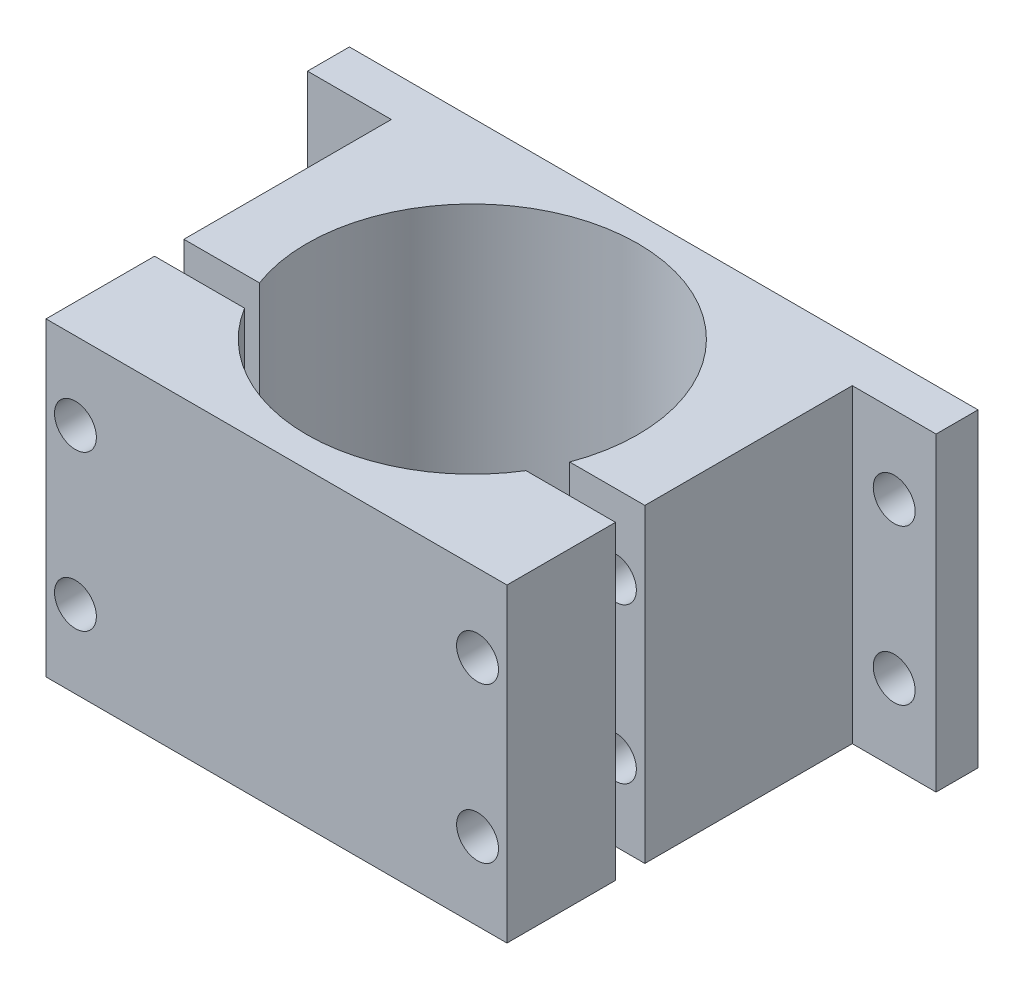
ISO-10303-21;
HEADER;
FILE_DESCRIPTION(('STEP AP214'),'2;1');
FILE_NAME('part.step','',(''),(''),'','','');
FILE_SCHEMA(('AUTOMOTIVE_DESIGN { 1 0 10303 214 1 1 1 1 }'));
ENDSEC;
DATA;
#1=APPLICATION_CONTEXT('core data for automotive mechanical design processes');
#2=APPLICATION_PROTOCOL_DEFINITION('international standard','automotive_design',2000,#1);
#3=PRODUCT_CONTEXT('',#1,'mechanical');
#4=PRODUCT('Part','Part','',(#3));
#5=PRODUCT_RELATED_PRODUCT_CATEGORY('part','',(#4));
#6=PRODUCT_DEFINITION_FORMATION('','',#4);
#7=PRODUCT_DEFINITION_CONTEXT('part definition',#1,'design');
#8=PRODUCT_DEFINITION('design','',#6,#7);
#9=PRODUCT_DEFINITION_SHAPE('','',#8);
#10=(LENGTH_UNIT() NAMED_UNIT(*) SI_UNIT(.MILLI.,.METRE.));
#11=(NAMED_UNIT(*) PLANE_ANGLE_UNIT() SI_UNIT($,.RADIAN.));
#12=(NAMED_UNIT(*) SI_UNIT($,.STERADIAN.) SOLID_ANGLE_UNIT());
#13=UNCERTAINTY_MEASURE_WITH_UNIT(LENGTH_MEASURE(1.E-05),#10,'distance_accuracy_value','');
#14=(GEOMETRIC_REPRESENTATION_CONTEXT(3) GLOBAL_UNCERTAINTY_ASSIGNED_CONTEXT((#13)) GLOBAL_UNIT_ASSIGNED_CONTEXT((#10,
#11,#12)) REPRESENTATION_CONTEXT('',''));
#15=CARTESIAN_POINT('',(0.,0.,0.));
#16=DIRECTION('',(0.,0.,1.));
#17=DIRECTION('',(1.,0.,0.));
#18=AXIS2_PLACEMENT_3D('',#15,#16,#17);
#19=CARTESIAN_POINT('',(0.,0.,5.));
#20=DIRECTION('',(0.,0.,-1.));
#21=DIRECTION('',(-1.,0.,0.));
#22=AXIS2_PLACEMENT_3D('',#19,#20,#21);
#23=PLANE('',#22);
#24=DIRECTION('',(0.,-1.,0.));
#25=VECTOR('',#24,1.);
#26=CARTESIAN_POINT('',(-27.5,18.5,5.));
#27=LINE('',#26,#25);
#28=CARTESIAN_POINT('',(-27.5,18.5,5.));
#29=VERTEX_POINT('',#28);
#30=CARTESIAN_POINT('',(-27.5,-18.5,5.));
#31=VERTEX_POINT('',#30);
#32=EDGE_CURVE('E174',#29,#31,#27,.T.);
#33=ORIENTED_EDGE('',*,*,#32,.F.);
#34=DIRECTION('',(-1.,0.,0.));
#35=VECTOR('',#34,1.);
#36=CARTESIAN_POINT('',(-37.5,18.5,5.));
#37=LINE('',#36,#35);
#38=CARTESIAN_POINT('',(-37.5,18.5,5.));
#39=VERTEX_POINT('',#38);
#40=EDGE_CURVE('E296',#29,#39,#37,.T.);
#41=ORIENTED_EDGE('',*,*,#40,.T.);
#42=DIRECTION('',(0.,-1.,0.));
#43=VECTOR('',#42,1.);
#44=CARTESIAN_POINT('',(-37.5,-18.5,5.));
#45=LINE('',#44,#43);
#46=CARTESIAN_POINT('',(-37.5,-18.5,5.));
#47=VERTEX_POINT('',#46);
#48=EDGE_CURVE('E278',#39,#47,#45,.T.);
#49=ORIENTED_EDGE('',*,*,#48,.T.);
#50=DIRECTION('',(1.,0.,0.));
#51=VECTOR('',#50,1.);
#52=CARTESIAN_POINT('',(-37.5,-18.5,5.));
#53=LINE('',#52,#51);
#54=EDGE_CURVE('E275',#47,#31,#53,.T.);
#55=ORIENTED_EDGE('',*,*,#54,.T.);
#56=EDGE_LOOP('',(#33,#41,#49,#55));
#57=FACE_BOUND('',#56,.T.);
#58=CARTESIAN_POINT('',(-32.5,-9.24999999999999,5.));
#59=DIRECTION('',(0.,0.,-1.));
#60=DIRECTION('',(-1.,0.,0.));
#61=AXIS2_PLACEMENT_3D('',#58,#59,#60);
#62=CIRCLE('',#61,2.50000000000002);
#63=CARTESIAN_POINT('',(-35.,-9.24999999999999,5.));
#64=VERTEX_POINT('',#63);
#65=EDGE_CURVE('E343',#64,#64,#62,.T.);
#66=ORIENTED_EDGE('',*,*,#65,.T.);
#67=EDGE_LOOP('',(#66));
#68=FACE_BOUND('',#67,.T.);
#69=CARTESIAN_POINT('',(-32.5,9.25000000000001,5.));
#70=DIRECTION('',(0.,0.,1.));
#71=DIRECTION('',(1.,0.,0.));
#72=AXIS2_PLACEMENT_3D('',#69,#70,#71);
#73=CIRCLE('',#72,2.50000000000002);
#74=CARTESIAN_POINT('',(-30.,9.25000000000001,5.));
#75=VERTEX_POINT('',#74);
#76=EDGE_CURVE('E351',#75,#75,#73,.T.);
#77=ORIENTED_EDGE('',*,*,#76,.F.);
#78=EDGE_LOOP('',(#77));
#79=FACE_BOUND('',#78,.T.);
#80=ADVANCED_FACE('F53',(#57,#68,#79),#23,.F.);
#81=DIRECTION('',(0.,1.,0.));
#82=VECTOR('',#81,1.);
#83=CARTESIAN_POINT('',(27.5,-18.5,5.));
#84=LINE('',#83,#82);
#85=CARTESIAN_POINT('',(27.5,-18.5,5.));
#86=VERTEX_POINT('',#85);
#87=CARTESIAN_POINT('',(27.5,18.5,5.));
#88=VERTEX_POINT('',#87);
#89=EDGE_CURVE('E178',#86,#88,#84,.T.);
#90=ORIENTED_EDGE('',*,*,#89,.F.);
#91=CARTESIAN_POINT('',(37.5,-18.5,5.));
#92=VERTEX_POINT('',#91);
#93=EDGE_CURVE('E154',#86,#92,#53,.T.);
#94=ORIENTED_EDGE('',*,*,#93,.T.);
#95=DIRECTION('',(0.,1.,0.));
#96=VECTOR('',#95,1.);
#97=CARTESIAN_POINT('',(37.5,-18.5,5.));
#98=LINE('',#97,#96);
#99=CARTESIAN_POINT('',(37.5,18.5,5.));
#100=VERTEX_POINT('',#99);
#101=EDGE_CURVE('E297',#92,#100,#98,.T.);
#102=ORIENTED_EDGE('',*,*,#101,.T.);
#103=EDGE_CURVE('E292',#100,#88,#37,.T.);
#104=ORIENTED_EDGE('',*,*,#103,.T.);
#105=EDGE_LOOP('',(#90,#94,#102,#104));
#106=FACE_BOUND('',#105,.T.);
#107=CARTESIAN_POINT('',(32.5,9.25,5.));
#108=DIRECTION('',(0.,0.,-1.));
#109=DIRECTION('',(-1.,0.,0.));
#110=AXIS2_PLACEMENT_3D('',#107,#108,#109);
#111=CIRCLE('',#110,2.5);
#112=CARTESIAN_POINT('',(30.,9.25,5.));
#113=VERTEX_POINT('',#112);
#114=EDGE_CURVE('E338',#113,#113,#111,.T.);
#115=ORIENTED_EDGE('',*,*,#114,.T.);
#116=EDGE_LOOP('',(#115));
#117=FACE_BOUND('',#116,.T.);
#118=CARTESIAN_POINT('',(32.5,-9.25,5.));
#119=DIRECTION('',(0.,0.,1.));
#120=DIRECTION('',(1.,0.,0.));
#121=AXIS2_PLACEMENT_3D('',#118,#119,#120);
#122=CIRCLE('',#121,2.5);
#123=CARTESIAN_POINT('',(35.,-9.25,5.));
#124=VERTEX_POINT('',#123);
#125=EDGE_CURVE('E334',#124,#124,#122,.T.);
#126=ORIENTED_EDGE('',*,*,#125,.F.);
#127=EDGE_LOOP('',(#126));
#128=FACE_BOUND('',#127,.T.);
#129=ADVANCED_FACE('F215',(#106,#117,#128),#23,.F.);
#130=CARTESIAN_POINT('',(0.,0.,0.));
#131=DIRECTION('',(0.,0.,-1.));
#132=DIRECTION('',(-1.,0.,0.));
#133=AXIS2_PLACEMENT_3D('',#130,#131,#132);
#134=PLANE('',#133);
#135=CARTESIAN_POINT('',(-32.5,-9.24999999999999,0.));
#136=DIRECTION('',(0.,0.,-1.));
#137=DIRECTION('',(-1.,0.,0.));
#138=AXIS2_PLACEMENT_3D('',#135,#136,#137);
#139=CIRCLE('',#138,2.50000000000002);
#140=CARTESIAN_POINT('',(-35.,-9.24999999999999,0.));
#141=VERTEX_POINT('',#140);
#142=EDGE_CURVE('E347',#141,#141,#139,.T.);
#143=ORIENTED_EDGE('',*,*,#142,.F.);
#144=EDGE_LOOP('',(#143));
#145=FACE_BOUND('',#144,.T.);
#146=CARTESIAN_POINT('',(32.5,9.25,0.));
#147=DIRECTION('',(0.,0.,-1.));
#148=DIRECTION('',(-1.,0.,0.));
#149=AXIS2_PLACEMENT_3D('',#146,#147,#148);
#150=CIRCLE('',#149,2.5);
#151=CARTESIAN_POINT('',(30.,9.25,0.));
#152=VERTEX_POINT('',#151);
#153=EDGE_CURVE('E358',#152,#152,#150,.T.);
#154=ORIENTED_EDGE('',*,*,#153,.F.);
#155=EDGE_LOOP('',(#154));
#156=FACE_BOUND('',#155,.T.);
#157=DIRECTION('',(0.,1.,0.));
#158=VECTOR('',#157,1.);
#159=CARTESIAN_POINT('',(37.5,-18.5,0.));
#160=LINE('',#159,#158);
#161=CARTESIAN_POINT('',(37.5,-18.5,0.));
#162=VERTEX_POINT('',#161);
#163=CARTESIAN_POINT('',(37.5,18.5,0.));
#164=VERTEX_POINT('',#163);
#165=EDGE_CURVE('E156',#162,#164,#160,.T.);
#166=ORIENTED_EDGE('',*,*,#165,.F.);
#167=DIRECTION('',(1.,0.,0.));
#168=VECTOR('',#167,1.);
#169=CARTESIAN_POINT('',(-37.5,-18.5,0.));
#170=LINE('',#169,#168);
#171=CARTESIAN_POINT('',(-37.5,-18.5,0.));
#172=VERTEX_POINT('',#171);
#173=EDGE_CURVE('E300',#172,#162,#170,.T.);
#174=ORIENTED_EDGE('',*,*,#173,.F.);
#175=DIRECTION('',(0.,-1.,0.));
#176=VECTOR('',#175,1.);
#177=CARTESIAN_POINT('',(-37.5,-18.5,0.));
#178=LINE('',#177,#176);
#179=CARTESIAN_POINT('',(-37.5,18.5,0.));
#180=VERTEX_POINT('',#179);
#181=EDGE_CURVE('E375',#180,#172,#178,.T.);
#182=ORIENTED_EDGE('',*,*,#181,.F.);
#183=DIRECTION('',(-1.,0.,0.));
#184=VECTOR('',#183,1.);
#185=CARTESIAN_POINT('',(-37.5,18.5,0.));
#186=LINE('',#185,#184);
#187=EDGE_CURVE('E163',#164,#180,#186,.T.);
#188=ORIENTED_EDGE('',*,*,#187,.F.);
#189=EDGE_LOOP('',(#166,#174,#182,#188));
#190=FACE_BOUND('',#189,.T.);
#191=CARTESIAN_POINT('',(32.5,-9.25,0.));
#192=DIRECTION('',(0.,0.,1.));
#193=DIRECTION('',(1.,0.,0.));
#194=AXIS2_PLACEMENT_3D('',#191,#192,#193);
#195=CIRCLE('',#194,2.5);
#196=CARTESIAN_POINT('',(35.,-9.25,0.));
#197=VERTEX_POINT('',#196);
#198=EDGE_CURVE('E339',#197,#197,#195,.T.);
#199=ORIENTED_EDGE('',*,*,#198,.T.);
#200=EDGE_LOOP('',(#199));
#201=FACE_BOUND('',#200,.T.);
#202=CARTESIAN_POINT('',(-32.5,9.25000000000001,0.));
#203=DIRECTION('',(0.,0.,1.));
#204=DIRECTION('',(1.,0.,0.));
#205=AXIS2_PLACEMENT_3D('',#202,#203,#204);
#206=CIRCLE('',#205,2.50000000000002);
#207=CARTESIAN_POINT('',(-30.,9.25000000000001,0.));
#208=VERTEX_POINT('',#207);
#209=EDGE_CURVE('E333',#208,#208,#206,.T.);
#210=ORIENTED_EDGE('',*,*,#209,.T.);
#211=EDGE_LOOP('',(#210));
#212=FACE_BOUND('',#211,.T.);
#213=ADVANCED_FACE('F221',(#145,#156,#190,#201,#212),#134,.T.);
#214=CARTESIAN_POINT('',(-37.5,18.5,5.));
#215=DIRECTION('',(0.,-1.,0.));
#216=DIRECTION('',(0.,0.,-1.));
#217=AXIS2_PLACEMENT_3D('',#214,#215,#216);
#218=PLANE('',#217);
#219=DIRECTION('',(0.,0.,-1.));
#220=VECTOR('',#219,1.);
#221=CARTESIAN_POINT('',(-27.5,18.5,46.2));
#222=LINE('',#221,#220);
#223=CARTESIAN_POINT('',(-27.5,18.5,29.7481346849605));
#224=VERTEX_POINT('',#223);
#225=EDGE_CURVE('E160',#224,#29,#222,.T.);
#226=ORIENTED_EDGE('',*,*,#225,.F.);
#227=DIRECTION('',(-1.,0.,0.));
#228=VECTOR('',#227,1.);
#229=CARTESIAN_POINT('',(-27.5,18.5,29.7481346849605));
#230=LINE('',#229,#228);
#231=CARTESIAN_POINT('',(-18.4844653821485,18.5,29.7481346849605));
#232=VERTEX_POINT('',#231);
#233=EDGE_CURVE('E310',#232,#224,#230,.T.);
#234=ORIENTED_EDGE('',*,*,#233,.F.);
#235=CARTESIAN_POINT('',(0.02356834465743,18.5,22.8550085750294));
#236=DIRECTION('',(0.,1.,0.));
#237=DIRECTION('',(0.,0.,1.));
#238=AXIS2_PLACEMENT_3D('',#235,#236,#237);
#239=CIRCLE('',#238,19.75);
#240=CARTESIAN_POINT('',(18.5316020714634,18.5,29.7481346849605));
#241=VERTEX_POINT('',#240);
#242=EDGE_CURVE('E177',#241,#232,#239,.T.);
#243=ORIENTED_EDGE('',*,*,#242,.F.);
#244=CARTESIAN_POINT('',(27.5,18.5,29.7481346849605));
#245=VERTEX_POINT('',#244);
#246=EDGE_CURVE('E79',#245,#241,#230,.T.);
#247=ORIENTED_EDGE('',*,*,#246,.F.);
#248=DIRECTION('',(0.,0.,-1.));
#249=VECTOR('',#248,1.);
#250=CARTESIAN_POINT('',(27.5,18.5,46.2));
#251=LINE('',#250,#249);
#252=EDGE_CURVE('E147',#245,#88,#251,.T.);
#253=ORIENTED_EDGE('',*,*,#252,.T.);
#254=ORIENTED_EDGE('',*,*,#103,.F.);
#255=DIRECTION('',(0.,0.,-1.));
#256=VECTOR('',#255,1.);
#257=CARTESIAN_POINT('',(37.5,18.5,5.));
#258=LINE('',#257,#256);
#259=EDGE_CURVE('E307',#100,#164,#258,.T.);
#260=ORIENTED_EDGE('',*,*,#259,.T.);
#261=ORIENTED_EDGE('',*,*,#187,.T.);
#262=DIRECTION('',(0.,0.,-1.));
#263=VECTOR('',#262,1.);
#264=CARTESIAN_POINT('',(-37.5,18.5,5.));
#265=LINE('',#264,#263);
#266=EDGE_CURVE('E367',#39,#180,#265,.T.);
#267=ORIENTED_EDGE('',*,*,#266,.F.);
#268=ORIENTED_EDGE('',*,*,#40,.F.);
#269=EDGE_LOOP('',(#226,#234,#243,#247,#253,#254,#260,#261,#267,#268));
#270=FACE_BOUND('',#269,.T.);
#271=ADVANCED_FACE('F255',(#270),#218,.F.);
#272=CARTESIAN_POINT('',(-37.5,-18.5,5.));
#273=DIRECTION('',(0.,1.,0.));
#274=DIRECTION('',(0.,0.,1.));
#275=AXIS2_PLACEMENT_3D('',#272,#273,#274);
#276=PLANE('',#275);
#277=DIRECTION('',(0.,0.,-1.));
#278=VECTOR('',#277,1.);
#279=CARTESIAN_POINT('',(27.5,-18.5,46.2));
#280=LINE('',#279,#278);
#281=CARTESIAN_POINT('',(27.5,-18.5,29.7481346849605));
#282=VERTEX_POINT('',#281);
#283=EDGE_CURVE('E145',#282,#86,#280,.T.);
#284=ORIENTED_EDGE('',*,*,#283,.F.);
#285=DIRECTION('',(-1.,0.,0.));
#286=VECTOR('',#285,1.);
#287=CARTESIAN_POINT('',(-27.5,-18.5,29.7481346849605));
#288=LINE('',#287,#286);
#289=CARTESIAN_POINT('',(18.5316020714634,-18.5,29.7481346849605));
#290=VERTEX_POINT('',#289);
#291=EDGE_CURVE('E131',#282,#290,#288,.T.);
#292=ORIENTED_EDGE('',*,*,#291,.T.);
#293=CARTESIAN_POINT('',(0.02356834465743,-18.5,22.8550085750294));
#294=DIRECTION('',(0.,1.,0.));
#295=DIRECTION('',(0.,0.,1.));
#296=AXIS2_PLACEMENT_3D('',#293,#294,#295);
#297=CIRCLE('',#296,19.75);
#298=CARTESIAN_POINT('',(-18.4844653821485,-18.5,29.7481346849605));
#299=VERTEX_POINT('',#298);
#300=EDGE_CURVE('E175',#290,#299,#297,.T.);
#301=ORIENTED_EDGE('',*,*,#300,.T.);
#302=CARTESIAN_POINT('',(-27.5,-18.5,29.7481346849605));
#303=VERTEX_POINT('',#302);
#304=EDGE_CURVE('E71',#299,#303,#288,.T.);
#305=ORIENTED_EDGE('',*,*,#304,.T.);
#306=DIRECTION('',(0.,0.,-1.));
#307=VECTOR('',#306,1.);
#308=CARTESIAN_POINT('',(-27.5,-18.5,46.2));
#309=LINE('',#308,#307);
#310=EDGE_CURVE('E171',#303,#31,#309,.T.);
#311=ORIENTED_EDGE('',*,*,#310,.T.);
#312=ORIENTED_EDGE('',*,*,#54,.F.);
#313=DIRECTION('',(0.,0.,-1.));
#314=VECTOR('',#313,1.);
#315=CARTESIAN_POINT('',(-37.5,-18.5,5.));
#316=LINE('',#315,#314);
#317=EDGE_CURVE('E286',#47,#172,#316,.T.);
#318=ORIENTED_EDGE('',*,*,#317,.T.);
#319=ORIENTED_EDGE('',*,*,#173,.T.);
#320=DIRECTION('',(0.,0.,-1.));
#321=VECTOR('',#320,1.);
#322=CARTESIAN_POINT('',(37.5,-18.5,5.));
#323=LINE('',#322,#321);
#324=EDGE_CURVE('E281',#92,#162,#323,.T.);
#325=ORIENTED_EDGE('',*,*,#324,.F.);
#326=ORIENTED_EDGE('',*,*,#93,.F.);
#327=EDGE_LOOP('',(#284,#292,#301,#305,#311,#312,#318,#319,#325,#326));
#328=FACE_BOUND('',#327,.T.);
#329=ADVANCED_FACE('F152',(#328),#276,.F.);
#330=CARTESIAN_POINT('',(27.5,-18.5,46.2));
#331=DIRECTION('',(-1.,0.,0.));
#332=DIRECTION('',(0.,0.,1.));
#333=AXIS2_PLACEMENT_3D('',#330,#331,#332);
#334=PLANE('',#333);
#335=ORIENTED_EDGE('',*,*,#252,.F.);
#336=DIRECTION('',(0.,1.,0.));
#337=VECTOR('',#336,1.);
#338=CARTESIAN_POINT('',(27.5,-18.5,29.7481346849605));
#339=LINE('',#338,#337);
#340=EDGE_CURVE('E134',#282,#245,#339,.T.);
#341=ORIENTED_EDGE('',*,*,#340,.F.);
#342=ORIENTED_EDGE('',*,*,#283,.T.);
#343=ORIENTED_EDGE('',*,*,#89,.T.);
#344=EDGE_LOOP('',(#335,#341,#342,#343));
#345=FACE_BOUND('',#344,.T.);
#346=ADVANCED_FACE('F55',(#345),#334,.F.);
#347=CARTESIAN_POINT('',(-27.5,18.5,46.2));
#348=DIRECTION('',(1.,0.,0.));
#349=DIRECTION('',(0.,0.,-1.));
#350=AXIS2_PLACEMENT_3D('',#347,#348,#349);
#351=PLANE('',#350);
#352=ORIENTED_EDGE('',*,*,#310,.F.);
#353=DIRECTION('',(0.,1.,0.));
#354=VECTOR('',#353,1.);
#355=CARTESIAN_POINT('',(-27.5,-18.5,29.7481346849605));
#356=LINE('',#355,#354);
#357=EDGE_CURVE('E149',#303,#224,#356,.T.);
#358=ORIENTED_EDGE('',*,*,#357,.T.);
#359=ORIENTED_EDGE('',*,*,#225,.T.);
#360=ORIENTED_EDGE('',*,*,#32,.T.);
#361=EDGE_LOOP('',(#352,#358,#359,#360));
#362=FACE_BOUND('',#361,.T.);
#363=ADVANCED_FACE('F262',(#362),#351,.F.);
#364=CARTESIAN_POINT('',(0.02356834465743,-18.5,22.8550085750294));
#365=DIRECTION('',(0.,1.,0.));
#366=DIRECTION('',(0.,0.,1.));
#367=AXIS2_PLACEMENT_3D('',#364,#365,#366);
#368=CYLINDRICAL_SURFACE('',#367,19.75);
#369=ORIENTED_EDGE('',*,*,#242,.T.);
#370=DIRECTION('',(0.,1.,0.));
#371=VECTOR('',#370,1.);
#372=CARTESIAN_POINT('',(-18.4844653821485,-18.5,29.7481346849605));
#373=LINE('',#372,#371);
#374=EDGE_CURVE('E323',#232,#299,#373,.F.);
#375=ORIENTED_EDGE('',*,*,#374,.T.);
#376=ORIENTED_EDGE('',*,*,#300,.F.);
#377=DIRECTION('',(0.,1.,0.));
#378=VECTOR('',#377,1.);
#379=CARTESIAN_POINT('',(18.5316020714634,-18.5,29.7481346849605));
#380=LINE('',#379,#378);
#381=EDGE_CURVE('E135',#290,#241,#380,.T.);
#382=ORIENTED_EDGE('',*,*,#381,.T.);
#383=EDGE_LOOP('',(#369,#375,#376,#382));
#384=FACE_BOUND('',#383,.T.);
#385=ADVANCED_FACE('F259',(#384),#368,.F.);
#386=CARTESIAN_POINT('',(37.5,-18.5,5.));
#387=DIRECTION('',(-1.,0.,0.));
#388=DIRECTION('',(0.,0.,1.));
#389=AXIS2_PLACEMENT_3D('',#386,#387,#388);
#390=PLANE('',#389);
#391=ORIENTED_EDGE('',*,*,#165,.T.);
#392=ORIENTED_EDGE('',*,*,#259,.F.);
#393=ORIENTED_EDGE('',*,*,#101,.F.);
#394=ORIENTED_EDGE('',*,*,#324,.T.);
#395=EDGE_LOOP('',(#391,#392,#393,#394));
#396=FACE_BOUND('',#395,.T.);
#397=ADVANCED_FACE('F261',(#396),#390,.F.);
#398=CARTESIAN_POINT('',(-37.5,-18.5,5.));
#399=DIRECTION('',(1.,0.,0.));
#400=DIRECTION('',(0.,0.,-1.));
#401=AXIS2_PLACEMENT_3D('',#398,#399,#400);
#402=PLANE('',#401);
#403=ORIENTED_EDGE('',*,*,#181,.T.);
#404=ORIENTED_EDGE('',*,*,#317,.F.);
#405=ORIENTED_EDGE('',*,*,#48,.F.);
#406=ORIENTED_EDGE('',*,*,#266,.T.);
#407=EDGE_LOOP('',(#403,#404,#405,#406));
#408=FACE_BOUND('',#407,.T.);
#409=ADVANCED_FACE('F383',(#408),#402,.F.);
#410=CARTESIAN_POINT('',(32.5,9.25,0.));
#411=DIRECTION('',(0.,0.,1.));
#412=DIRECTION('',(1.,0.,0.));
#413=AXIS2_PLACEMENT_3D('',#410,#411,#412);
#414=CYLINDRICAL_SURFACE('',#413,2.5);
#415=ORIENTED_EDGE('',*,*,#153,.T.);
#416=EDGE_LOOP('',(#415));
#417=FACE_BOUND('',#416,.T.);
#418=ORIENTED_EDGE('',*,*,#114,.F.);
#419=EDGE_LOOP('',(#418));
#420=FACE_BOUND('',#419,.T.);
#421=ADVANCED_FACE('F392',(#417,#420),#414,.F.);
#422=CARTESIAN_POINT('',(32.5,-9.25,0.));
#423=DIRECTION('',(0.,0.,1.));
#424=DIRECTION('',(1.,0.,0.));
#425=AXIS2_PLACEMENT_3D('',#422,#423,#424);
#426=CYLINDRICAL_SURFACE('',#425,2.5);
#427=ORIENTED_EDGE('',*,*,#198,.F.);
#428=EDGE_LOOP('',(#427));
#429=FACE_BOUND('',#428,.T.);
#430=ORIENTED_EDGE('',*,*,#125,.T.);
#431=EDGE_LOOP('',(#430));
#432=FACE_BOUND('',#431,.T.);
#433=ADVANCED_FACE('F396',(#429,#432),#426,.F.);
#434=CARTESIAN_POINT('',(-32.5,-9.24999999999999,0.));
#435=DIRECTION('',(0.,0.,1.));
#436=DIRECTION('',(1.,0.,0.));
#437=AXIS2_PLACEMENT_3D('',#434,#435,#436);
#438=CYLINDRICAL_SURFACE('',#437,2.50000000000002);
#439=ORIENTED_EDGE('',*,*,#142,.T.);
#440=EDGE_LOOP('',(#439));
#441=FACE_BOUND('',#440,.T.);
#442=ORIENTED_EDGE('',*,*,#65,.F.);
#443=EDGE_LOOP('',(#442));
#444=FACE_BOUND('',#443,.T.);
#445=ADVANCED_FACE('F401',(#441,#444),#438,.F.);
#446=CARTESIAN_POINT('',(-32.5,9.25000000000001,0.));
#447=DIRECTION('',(0.,0.,1.));
#448=DIRECTION('',(1.,0.,0.));
#449=AXIS2_PLACEMENT_3D('',#446,#447,#448);
#450=CYLINDRICAL_SURFACE('',#449,2.50000000000002);
#451=ORIENTED_EDGE('',*,*,#209,.F.);
#452=EDGE_LOOP('',(#451));
#453=FACE_BOUND('',#452,.T.);
#454=ORIENTED_EDGE('',*,*,#76,.T.);
#455=EDGE_LOOP('',(#454));
#456=FACE_BOUND('',#455,.T.);
#457=ADVANCED_FACE('F398',(#453,#456),#450,.F.);
#458=CARTESIAN_POINT('',(-27.5,-18.5,29.7481346849605));
#459=DIRECTION('',(0.,0.,-1.));
#460=DIRECTION('',(-1.,0.,0.));
#461=AXIS2_PLACEMENT_3D('',#458,#459,#460);
#462=PLANE('',#461);
#463=CARTESIAN_POINT('',(23.9882158276713,9.25,29.7481346849605));
#464=DIRECTION('',(0.,0.,-1.));
#465=DIRECTION('',(-1.,0.,0.));
#466=AXIS2_PLACEMENT_3D('',#463,#464,#465);
#467=CIRCLE('',#466,2.49812931934355);
#468=CARTESIAN_POINT('',(21.4900865083277,9.25,29.7481346849605));
#469=VERTEX_POINT('',#468);
#470=EDGE_CURVE('E57',#469,#469,#467,.T.);
#471=ORIENTED_EDGE('',*,*,#470,.T.);
#472=EDGE_LOOP('',(#471));
#473=FACE_BOUND('',#472,.T.);
#474=CARTESIAN_POINT('',(23.9882158276713,-9.25,29.7481346849605));
#475=DIRECTION('',(0.,0.,-1.));
#476=DIRECTION('',(-1.,0.,0.));
#477=AXIS2_PLACEMENT_3D('',#474,#475,#476);
#478=CIRCLE('',#477,2.49812931934355);
#479=CARTESIAN_POINT('',(21.4900865083277,-9.25,29.7481346849605));
#480=VERTEX_POINT('',#479);
#481=EDGE_CURVE('E317',#480,#480,#478,.F.);
#482=ORIENTED_EDGE('',*,*,#481,.F.);
#483=EDGE_LOOP('',(#482));
#484=FACE_BOUND('',#483,.T.);
#485=ORIENTED_EDGE('',*,*,#291,.F.);
#486=ORIENTED_EDGE('',*,*,#340,.T.);
#487=ORIENTED_EDGE('',*,*,#246,.T.);
#488=ORIENTED_EDGE('',*,*,#381,.F.);
#489=EDGE_LOOP('',(#485,#486,#487,#488));
#490=FACE_BOUND('',#489,.T.);
#491=ADVANCED_FACE('F133',(#473,#484,#490),#462,.F.);
#492=CARTESIAN_POINT('',(23.9882158276713,-9.25,21.2));
#493=DIRECTION('',(0.,0.,1.));
#494=DIRECTION('',(1.,0.,0.));
#495=AXIS2_PLACEMENT_3D('',#492,#493,#494);
#496=PLANE('',#495);
#497=CARTESIAN_POINT('',(23.9882158276713,-9.25,21.2));
#498=DIRECTION('',(0.,0.,1.));
#499=DIRECTION('',(1.,0.,0.));
#500=AXIS2_PLACEMENT_3D('',#497,#498,#499);
#501=CIRCLE('',#500,2.49812931934355);
#502=CARTESIAN_POINT('',(26.4863451470148,-9.25,21.2));
#503=VERTEX_POINT('',#502);
#504=EDGE_CURVE('E166',#503,#503,#501,.T.);
#505=ORIENTED_EDGE('',*,*,#504,.T.);
#506=EDGE_LOOP('',(#505));
#507=FACE_BOUND('',#506,.T.);
#508=ADVANCED_FACE('F245',(#507),#496,.T.);
#509=CARTESIAN_POINT('',(23.9882158276713,-9.25,21.2));
#510=DIRECTION('',(0.,0.,1.));
#511=DIRECTION('',(1.,0.,0.));
#512=AXIS2_PLACEMENT_3D('',#509,#510,#511);
#513=CYLINDRICAL_SURFACE('',#512,2.49812931934355);
#514=ORIENTED_EDGE('',*,*,#481,.T.);
#515=EDGE_LOOP('',(#514));
#516=FACE_BOUND('',#515,.T.);
#517=ORIENTED_EDGE('',*,*,#504,.F.);
#518=EDGE_LOOP('',(#517));
#519=FACE_BOUND('',#518,.T.);
#520=ADVANCED_FACE('F210',(#516,#519),#513,.F.);
#521=ORIENTED_EDGE('',*,*,#233,.T.);
#522=ORIENTED_EDGE('',*,*,#357,.F.);
#523=ORIENTED_EDGE('',*,*,#304,.F.);
#524=ORIENTED_EDGE('',*,*,#374,.F.);
#525=EDGE_LOOP('',(#521,#522,#523,#524));
#526=FACE_BOUND('',#525,.T.);
#527=CARTESIAN_POINT('',(-23.9882158276713,-9.25,29.7481346849605));
#528=DIRECTION('',(0.,0.,-1.));
#529=DIRECTION('',(-1.,0.,0.));
#530=AXIS2_PLACEMENT_3D('',#527,#528,#529);
#531=CIRCLE('',#530,2.49812931934355);
#532=CARTESIAN_POINT('',(-26.4863451470148,-9.25,29.7481346849605));
#533=VERTEX_POINT('',#532);
#534=EDGE_CURVE('E326',#533,#533,#531,.T.);
#535=ORIENTED_EDGE('',*,*,#534,.T.);
#536=EDGE_LOOP('',(#535));
#537=FACE_BOUND('',#536,.T.);
#538=CARTESIAN_POINT('',(-23.9882158276713,9.25,29.7481346849605));
#539=DIRECTION('',(0.,0.,-1.));
#540=DIRECTION('',(-1.,0.,0.));
#541=AXIS2_PLACEMENT_3D('',#538,#539,#540);
#542=CIRCLE('',#541,2.49812931934355);
#543=CARTESIAN_POINT('',(-26.4863451470148,9.25,29.7481346849605));
#544=VERTEX_POINT('',#543);
#545=EDGE_CURVE('E330',#544,#544,#542,.F.);
#546=ORIENTED_EDGE('',*,*,#545,.F.);
#547=EDGE_LOOP('',(#546));
#548=FACE_BOUND('',#547,.T.);
#549=ADVANCED_FACE('F201',(#526,#537,#548),#462,.F.);
#550=CARTESIAN_POINT('',(-23.9882158276713,-9.25,21.2));
#551=DIRECTION('',(0.,0.,-1.));
#552=DIRECTION('',(-1.,0.,0.));
#553=AXIS2_PLACEMENT_3D('',#550,#551,#552);
#554=PLANE('',#553);
#555=CARTESIAN_POINT('',(-23.9882158276713,-9.25,21.2));
#556=DIRECTION('',(0.,0.,-1.));
#557=DIRECTION('',(-1.,0.,0.));
#558=AXIS2_PLACEMENT_3D('',#555,#556,#557);
#559=CIRCLE('',#558,2.49812931934355);
#560=CARTESIAN_POINT('',(-26.4863451470148,-9.25,21.2));
#561=VERTEX_POINT('',#560);
#562=EDGE_CURVE('E63',#561,#561,#559,.T.);
#563=ORIENTED_EDGE('',*,*,#562,.F.);
#564=EDGE_LOOP('',(#563));
#565=FACE_BOUND('',#564,.T.);
#566=ADVANCED_FACE('F199',(#565),#554,.F.);
#567=CARTESIAN_POINT('',(-23.9882158276713,-9.25,21.2));
#568=DIRECTION('',(0.,0.,1.));
#569=DIRECTION('',(1.,0.,0.));
#570=AXIS2_PLACEMENT_3D('',#567,#568,#569);
#571=CYLINDRICAL_SURFACE('',#570,2.49812931934355);
#572=ORIENTED_EDGE('',*,*,#534,.F.);
#573=EDGE_LOOP('',(#572));
#574=FACE_BOUND('',#573,.T.);
#575=ORIENTED_EDGE('',*,*,#562,.T.);
#576=EDGE_LOOP('',(#575));
#577=FACE_BOUND('',#576,.T.);
#578=ADVANCED_FACE('F197',(#574,#577),#571,.F.);
#579=CARTESIAN_POINT('',(-23.9882158276713,9.25,21.2));
#580=DIRECTION('',(0.,0.,1.));
#581=DIRECTION('',(1.,0.,0.));
#582=AXIS2_PLACEMENT_3D('',#579,#580,#581);
#583=PLANE('',#582);
#584=CARTESIAN_POINT('',(-23.9882158276713,9.25,21.2));
#585=DIRECTION('',(0.,0.,1.));
#586=DIRECTION('',(1.,0.,0.));
#587=AXIS2_PLACEMENT_3D('',#584,#585,#586);
#588=CIRCLE('',#587,2.49812931934355);
#589=CARTESIAN_POINT('',(-21.4900865083277,9.25,21.2));
#590=VERTEX_POINT('',#589);
#591=EDGE_CURVE('E12',#590,#590,#588,.T.);
#592=ORIENTED_EDGE('',*,*,#591,.T.);
#593=EDGE_LOOP('',(#592));
#594=FACE_BOUND('',#593,.T.);
#595=ADVANCED_FACE('F207',(#594),#583,.T.);
#596=CARTESIAN_POINT('',(-23.9882158276713,9.25,21.2));
#597=DIRECTION('',(0.,0.,1.));
#598=DIRECTION('',(1.,0.,0.));
#599=AXIS2_PLACEMENT_3D('',#596,#597,#598);
#600=CYLINDRICAL_SURFACE('',#599,2.49812931934355);
#601=ORIENTED_EDGE('',*,*,#545,.T.);
#602=EDGE_LOOP('',(#601));
#603=FACE_BOUND('',#602,.T.);
#604=ORIENTED_EDGE('',*,*,#591,.F.);
#605=EDGE_LOOP('',(#604));
#606=FACE_BOUND('',#605,.T.);
#607=ADVANCED_FACE('F231',(#603,#606),#600,.F.);
#608=CARTESIAN_POINT('',(23.9882158276713,9.25,21.2));
#609=DIRECTION('',(0.,0.,-1.));
#610=DIRECTION('',(-1.,0.,0.));
#611=AXIS2_PLACEMENT_3D('',#608,#609,#610);
#612=PLANE('',#611);
#613=CARTESIAN_POINT('',(23.9882158276713,9.25,21.2));
#614=DIRECTION('',(0.,0.,-1.));
#615=DIRECTION('',(-1.,0.,0.));
#616=AXIS2_PLACEMENT_3D('',#613,#614,#615);
#617=CIRCLE('',#616,2.49812931934355);
#618=CARTESIAN_POINT('',(21.4900865083277,9.25,21.2));
#619=VERTEX_POINT('',#618);
#620=EDGE_CURVE('E181',#619,#619,#617,.T.);
#621=ORIENTED_EDGE('',*,*,#620,.F.);
#622=EDGE_LOOP('',(#621));
#623=FACE_BOUND('',#622,.T.);
#624=ADVANCED_FACE('F228',(#623),#612,.F.);
#625=CARTESIAN_POINT('',(23.9882158276713,9.25,21.2));
#626=DIRECTION('',(0.,0.,1.));
#627=DIRECTION('',(1.,0.,0.));
#628=AXIS2_PLACEMENT_3D('',#625,#626,#627);
#629=CYLINDRICAL_SURFACE('',#628,2.49812931934355);
#630=ORIENTED_EDGE('',*,*,#470,.F.);
#631=EDGE_LOOP('',(#630));
#632=FACE_BOUND('',#631,.T.);
#633=ORIENTED_EDGE('',*,*,#620,.T.);
#634=EDGE_LOOP('',(#633));
#635=FACE_BOUND('',#634,.T.);
#636=ADVANCED_FACE('F230',(#632,#635),#629,.F.);
#637=CLOSED_SHELL('',(#80,#129,#213,#271,#329,#346,#363,#385,#397,#409,#421,#433,#445,#457,#491,
#508,#520,#549,#566,#578,#595,#607,#624,#636));
#638=MANIFOLD_SOLID_BREP('B2',#637);
#639=CARTESIAN_POINT('',(-27.5,-18.51,33.2481346849605));
#640=DIRECTION('',(0.,0.,1.));
#641=DIRECTION('',(1.,0.,0.));
#642=AXIS2_PLACEMENT_3D('',#639,#640,#641);
#643=PLANE('',#642);
#644=CARTESIAN_POINT('',(23.9882158276713,9.25,33.2481346849605));
#645=DIRECTION('',(0.,0.,1.));
#646=DIRECTION('',(1.,0.,0.));
#647=AXIS2_PLACEMENT_3D('',#644,#645,#646);
#648=CIRCLE('',#647,2.49812931934355);
#649=CARTESIAN_POINT('',(26.4863451470148,9.25,33.2481346849605));
#650=VERTEX_POINT('',#649);
#651=EDGE_CURVE('E639',#650,#650,#648,.T.);
#652=ORIENTED_EDGE('',*,*,#651,.T.);
#653=EDGE_LOOP('',(#652));
#654=FACE_BOUND('',#653,.T.);
#655=CARTESIAN_POINT('',(23.9882158276713,-9.25,33.2481346849605));
#656=DIRECTION('',(0.,0.,1.));
#657=DIRECTION('',(1.,0.,0.));
#658=AXIS2_PLACEMENT_3D('',#655,#656,#657);
#659=CIRCLE('',#658,2.49812931934355);
#660=CARTESIAN_POINT('',(26.4863451470148,-9.25,33.2481346849605));
#661=VERTEX_POINT('',#660);
#662=EDGE_CURVE('E708',#661,#661,#659,.F.);
#663=ORIENTED_EDGE('',*,*,#662,.F.);
#664=EDGE_LOOP('',(#663));
#665=FACE_BOUND('',#664,.T.);
#666=DIRECTION('',(0.,1.,0.));
#667=VECTOR('',#666,1.);
#668=CARTESIAN_POINT('',(16.8177765624648,-18.5,33.2481346849605));
#669=LINE('',#668,#667);
#670=CARTESIAN_POINT('',(16.8177765624648,18.5,33.2481346849605));
#671=VERTEX_POINT('',#670);
#672=CARTESIAN_POINT('',(16.8177765624648,-18.5,33.2481346849605));
#673=VERTEX_POINT('',#672);
#674=EDGE_CURVE('E634',#671,#673,#669,.F.);
#675=ORIENTED_EDGE('',*,*,#674,.F.);
#676=DIRECTION('',(-1.,0.,0.));
#677=VECTOR('',#676,1.);
#678=CARTESIAN_POINT('',(-37.5,18.5,33.2481346849605));
#679=LINE('',#678,#677);
#680=CARTESIAN_POINT('',(27.5,18.5,33.2481346849605));
#681=VERTEX_POINT('',#680);
#682=EDGE_CURVE('E719',#681,#671,#679,.T.);
#683=ORIENTED_EDGE('',*,*,#682,.F.);
#684=DIRECTION('',(0.,1.,0.));
#685=VECTOR('',#684,1.);
#686=CARTESIAN_POINT('',(27.5,-18.5,33.2481346849605));
#687=LINE('',#686,#685);
#688=CARTESIAN_POINT('',(27.5,-18.5,33.2481346849605));
#689=VERTEX_POINT('',#688);
#690=EDGE_CURVE('E654',#689,#681,#687,.T.);
#691=ORIENTED_EDGE('',*,*,#690,.F.);
#692=DIRECTION('',(1.,0.,0.));
#693=VECTOR('',#692,1.);
#694=CARTESIAN_POINT('',(-37.5,-18.5,33.2481346849605));
#695=LINE('',#694,#693);
#696=EDGE_CURVE('E647',#673,#689,#695,.T.);
#697=ORIENTED_EDGE('',*,*,#696,.F.);
#698=EDGE_LOOP('',(#675,#683,#691,#697));
#699=FACE_BOUND('',#698,.T.);
#700=ADVANCED_FACE('F631',(#654,#665,#699),#643,.F.);
#701=CARTESIAN_POINT('',(-23.9882158276713,-9.25,33.2481346849605));
#702=DIRECTION('',(0.,0.,1.));
#703=DIRECTION('',(1.,0.,0.));
#704=AXIS2_PLACEMENT_3D('',#701,#702,#703);
#705=CIRCLE('',#704,2.49812931934355);
#706=CARTESIAN_POINT('',(-21.4900865083277,-9.25,33.2481346849605));
#707=VERTEX_POINT('',#706);
#708=EDGE_CURVE('E51',#707,#707,#705,.T.);
#709=ORIENTED_EDGE('',*,*,#708,.T.);
#710=EDGE_LOOP('',(#709));
#711=FACE_BOUND('',#710,.T.);
#712=CARTESIAN_POINT('',(-23.9882158276713,9.25,33.2481346849605));
#713=DIRECTION('',(0.,0.,1.));
#714=DIRECTION('',(1.,0.,0.));
#715=AXIS2_PLACEMENT_3D('',#712,#713,#714);
#716=CIRCLE('',#715,2.49812931934355);
#717=CARTESIAN_POINT('',(-21.4900865083277,9.25,33.2481346849605));
#718=VERTEX_POINT('',#717);
#719=EDGE_CURVE('E705',#718,#718,#716,.F.);
#720=ORIENTED_EDGE('',*,*,#719,.F.);
#721=EDGE_LOOP('',(#720));
#722=FACE_BOUND('',#721,.T.);
#723=DIRECTION('',(0.,-1.,0.));
#724=VECTOR('',#723,1.);
#725=CARTESIAN_POINT('',(-27.5,18.5,33.2481346849605));
#726=LINE('',#725,#724);
#727=CARTESIAN_POINT('',(-27.5,18.5,33.2481346849605));
#728=VERTEX_POINT('',#727);
#729=CARTESIAN_POINT('',(-27.5,-18.5,33.2481346849605));
#730=VERTEX_POINT('',#729);
#731=EDGE_CURVE('E714',#728,#730,#726,.T.);
#732=ORIENTED_EDGE('',*,*,#731,.F.);
#733=CARTESIAN_POINT('',(-16.77063987315,18.5,33.2481346849605));
#734=VERTEX_POINT('',#733);
#735=EDGE_CURVE('E718',#734,#728,#679,.T.);
#736=ORIENTED_EDGE('',*,*,#735,.F.);
#737=DIRECTION('',(0.,1.,0.));
#738=VECTOR('',#737,1.);
#739=CARTESIAN_POINT('',(-16.77063987315,-18.5,33.2481346849605));
#740=LINE('',#739,#738);
#741=CARTESIAN_POINT('',(-16.77063987315,-18.5,33.2481346849605));
#742=VERTEX_POINT('',#741);
#743=EDGE_CURVE('E724',#742,#734,#740,.T.);
#744=ORIENTED_EDGE('',*,*,#743,.F.);
#745=EDGE_CURVE('E720',#730,#742,#695,.T.);
#746=ORIENTED_EDGE('',*,*,#745,.F.);
#747=EDGE_LOOP('',(#732,#736,#744,#746));
#748=FACE_BOUND('',#747,.T.);
#749=ADVANCED_FACE('F733',(#711,#722,#748),#643,.F.);
#750=CARTESIAN_POINT('',(0.,0.,46.2));
#751=DIRECTION('',(0.,0.,1.));
#752=DIRECTION('',(1.,0.,0.));
#753=AXIS2_PLACEMENT_3D('',#750,#751,#752);
#754=PLANE('',#753);
#755=CARTESIAN_POINT('',(-23.9882158276713,-9.25,46.2));
#756=DIRECTION('',(0.,0.,-1.));
#757=DIRECTION('',(-1.,0.,0.));
#758=AXIS2_PLACEMENT_3D('',#755,#756,#757);
#759=CIRCLE('',#758,2.49812931934355);
#760=CARTESIAN_POINT('',(-26.4863451470148,-9.25,46.2));
#761=VERTEX_POINT('',#760);
#762=EDGE_CURVE('E775',#761,#761,#759,.T.);
#763=ORIENTED_EDGE('',*,*,#762,.T.);
#764=EDGE_LOOP('',(#763));
#765=FACE_BOUND('',#764,.T.);
#766=CARTESIAN_POINT('',(23.9882158276713,9.25,46.2));
#767=DIRECTION('',(0.,0.,-1.));
#768=DIRECTION('',(-1.,0.,0.));
#769=AXIS2_PLACEMENT_3D('',#766,#767,#768);
#770=CIRCLE('',#769,2.49812931934355);
#771=CARTESIAN_POINT('',(21.4900865083277,9.25,46.2));
#772=VERTEX_POINT('',#771);
#773=EDGE_CURVE('E742',#772,#772,#770,.T.);
#774=ORIENTED_EDGE('',*,*,#773,.T.);
#775=EDGE_LOOP('',(#774));
#776=FACE_BOUND('',#775,.T.);
#777=DIRECTION('',(1.,0.,0.));
#778=VECTOR('',#777,1.);
#779=CARTESIAN_POINT('',(-27.5,-18.5,46.2));
#780=LINE('',#779,#778);
#781=CARTESIAN_POINT('',(-27.5,-18.5,46.2));
#782=VERTEX_POINT('',#781);
#783=CARTESIAN_POINT('',(27.5,-18.5,46.2));
#784=VERTEX_POINT('',#783);
#785=EDGE_CURVE('E693',#782,#784,#780,.T.);
#786=ORIENTED_EDGE('',*,*,#785,.T.);
#787=DIRECTION('',(0.,1.,0.));
#788=VECTOR('',#787,1.);
#789=CARTESIAN_POINT('',(27.5,-18.5,46.2));
#790=LINE('',#789,#788);
#791=CARTESIAN_POINT('',(27.5,18.5,46.2));
#792=VERTEX_POINT('',#791);
#793=EDGE_CURVE('E684',#784,#792,#790,.T.);
#794=ORIENTED_EDGE('',*,*,#793,.T.);
#795=DIRECTION('',(-1.,0.,0.));
#796=VECTOR('',#795,1.);
#797=CARTESIAN_POINT('',(-27.5,18.5,46.2));
#798=LINE('',#797,#796);
#799=CARTESIAN_POINT('',(-27.5,18.5,46.2));
#800=VERTEX_POINT('',#799);
#801=EDGE_CURVE('E692',#792,#800,#798,.T.);
#802=ORIENTED_EDGE('',*,*,#801,.T.);
#803=DIRECTION('',(0.,-1.,0.));
#804=VECTOR('',#803,1.);
#805=CARTESIAN_POINT('',(-27.5,18.5,46.2));
#806=LINE('',#805,#804);
#807=EDGE_CURVE('E699',#800,#782,#806,.T.);
#808=ORIENTED_EDGE('',*,*,#807,.T.);
#809=EDGE_LOOP('',(#786,#794,#802,#808));
#810=FACE_BOUND('',#809,.T.);
#811=CARTESIAN_POINT('',(23.9882158276713,-9.25,46.2));
#812=DIRECTION('',(0.,0.,1.));
#813=DIRECTION('',(1.,0.,0.));
#814=AXIS2_PLACEMENT_3D('',#811,#812,#813);
#815=CIRCLE('',#814,2.49812931934355);
#816=CARTESIAN_POINT('',(26.4863451470148,-9.25,46.2));
#817=VERTEX_POINT('',#816);
#818=EDGE_CURVE('E774',#817,#817,#815,.T.);
#819=ORIENTED_EDGE('',*,*,#818,.F.);
#820=EDGE_LOOP('',(#819));
#821=FACE_BOUND('',#820,.T.);
#822=CARTESIAN_POINT('',(-23.9882158276713,9.25,46.2));
#823=DIRECTION('',(0.,0.,1.));
#824=DIRECTION('',(1.,0.,0.));
#825=AXIS2_PLACEMENT_3D('',#822,#823,#824);
#826=CIRCLE('',#825,2.49812931934355);
#827=CARTESIAN_POINT('',(-21.4900865083277,9.25,46.2));
#828=VERTEX_POINT('',#827);
#829=EDGE_CURVE('E779',#828,#828,#826,.T.);
#830=ORIENTED_EDGE('',*,*,#829,.F.);
#831=EDGE_LOOP('',(#830));
#832=FACE_BOUND('',#831,.T.);
#833=ADVANCED_FACE('F696',(#765,#776,#810,#821,#832),#754,.T.);
#834=CARTESIAN_POINT('',(-23.9882158276713,9.25,21.2));
#835=DIRECTION('',(0.,0.,1.));
#836=DIRECTION('',(1.,0.,0.));
#837=AXIS2_PLACEMENT_3D('',#834,#835,#836);
#838=CYLINDRICAL_SURFACE('',#837,2.49812931934355);
#839=ORIENTED_EDGE('',*,*,#719,.T.);
#840=EDGE_LOOP('',(#839));
#841=FACE_BOUND('',#840,.T.);
#842=ORIENTED_EDGE('',*,*,#829,.T.);
#843=EDGE_LOOP('',(#842));
#844=FACE_BOUND('',#843,.T.);
#845=ADVANCED_FACE('F784',(#841,#844),#838,.F.);
#846=CARTESIAN_POINT('',(-23.9882158276713,-9.25,21.2));
#847=DIRECTION('',(0.,0.,1.));
#848=DIRECTION('',(1.,0.,0.));
#849=AXIS2_PLACEMENT_3D('',#846,#847,#848);
#850=CYLINDRICAL_SURFACE('',#849,2.49812931934355);
#851=ORIENTED_EDGE('',*,*,#708,.F.);
#852=EDGE_LOOP('',(#851));
#853=FACE_BOUND('',#852,.T.);
#854=ORIENTED_EDGE('',*,*,#762,.F.);
#855=EDGE_LOOP('',(#854));
#856=FACE_BOUND('',#855,.T.);
#857=ADVANCED_FACE('F770',(#853,#856),#850,.F.);
#858=CARTESIAN_POINT('',(23.9882158276713,-9.25,21.2));
#859=DIRECTION('',(0.,0.,1.));
#860=DIRECTION('',(1.,0.,0.));
#861=AXIS2_PLACEMENT_3D('',#858,#859,#860);
#862=CYLINDRICAL_SURFACE('',#861,2.49812931934355);
#863=ORIENTED_EDGE('',*,*,#662,.T.);
#864=EDGE_LOOP('',(#863));
#865=FACE_BOUND('',#864,.T.);
#866=ORIENTED_EDGE('',*,*,#818,.T.);
#867=EDGE_LOOP('',(#866));
#868=FACE_BOUND('',#867,.T.);
#869=ADVANCED_FACE('F766',(#865,#868),#862,.F.);
#870=CARTESIAN_POINT('',(23.9882158276713,9.25,21.2));
#871=DIRECTION('',(0.,0.,1.));
#872=DIRECTION('',(1.,0.,0.));
#873=AXIS2_PLACEMENT_3D('',#870,#871,#872);
#874=CYLINDRICAL_SURFACE('',#873,2.49812931934355);
#875=ORIENTED_EDGE('',*,*,#651,.F.);
#876=EDGE_LOOP('',(#875));
#877=FACE_BOUND('',#876,.T.);
#878=ORIENTED_EDGE('',*,*,#773,.F.);
#879=EDGE_LOOP('',(#878));
#880=FACE_BOUND('',#879,.T.);
#881=ADVANCED_FACE('F769',(#877,#880),#874,.F.);
#882=CARTESIAN_POINT('',(-37.5,-18.5,5.));
#883=DIRECTION('',(0.,1.,0.));
#884=DIRECTION('',(0.,0.,1.));
#885=AXIS2_PLACEMENT_3D('',#882,#883,#884);
#886=PLANE('',#885);
#887=DIRECTION('',(0.,0.,-1.));
#888=VECTOR('',#887,1.);
#889=CARTESIAN_POINT('',(-27.5,-18.5,46.2));
#890=LINE('',#889,#888);
#891=EDGE_CURVE('E729',#782,#730,#890,.T.);
#892=ORIENTED_EDGE('',*,*,#891,.T.);
#893=ORIENTED_EDGE('',*,*,#745,.T.);
#894=CARTESIAN_POINT('',(0.02356834465743,-18.5,22.8550085750294));
#895=DIRECTION('',(0.,1.,0.));
#896=DIRECTION('',(0.,0.,1.));
#897=AXIS2_PLACEMENT_3D('',#894,#895,#896);
#898=CIRCLE('',#897,19.75);
#899=EDGE_CURVE('E702',#742,#673,#898,.T.);
#900=ORIENTED_EDGE('',*,*,#899,.T.);
#901=ORIENTED_EDGE('',*,*,#696,.T.);
#902=DIRECTION('',(0.,0.,-1.));
#903=VECTOR('',#902,1.);
#904=CARTESIAN_POINT('',(27.5,-18.5,46.2));
#905=LINE('',#904,#903);
#906=EDGE_CURVE('E687',#784,#689,#905,.T.);
#907=ORIENTED_EDGE('',*,*,#906,.F.);
#908=ORIENTED_EDGE('',*,*,#785,.F.);
#909=EDGE_LOOP('',(#892,#893,#900,#901,#907,#908));
#910=FACE_BOUND('',#909,.T.);
#911=ADVANCED_FACE('F704',(#910),#886,.F.);
#912=CARTESIAN_POINT('',(-37.5,18.5,5.));
#913=DIRECTION('',(0.,-1.,0.));
#914=DIRECTION('',(0.,0.,-1.));
#915=AXIS2_PLACEMENT_3D('',#912,#913,#914);
#916=PLANE('',#915);
#917=DIRECTION('',(0.,0.,-1.));
#918=VECTOR('',#917,1.);
#919=CARTESIAN_POINT('',(27.5,18.5,46.2));
#920=LINE('',#919,#918);
#921=EDGE_CURVE('E689',#792,#681,#920,.T.);
#922=ORIENTED_EDGE('',*,*,#921,.T.);
#923=ORIENTED_EDGE('',*,*,#682,.T.);
#924=CARTESIAN_POINT('',(0.02356834465743,18.5,22.8550085750294));
#925=DIRECTION('',(0.,1.,0.));
#926=DIRECTION('',(0.,0.,1.));
#927=AXIS2_PLACEMENT_3D('',#924,#925,#926);
#928=CIRCLE('',#927,19.75);
#929=EDGE_CURVE('E740',#734,#671,#928,.T.);
#930=ORIENTED_EDGE('',*,*,#929,.F.);
#931=ORIENTED_EDGE('',*,*,#735,.T.);
#932=DIRECTION('',(0.,0.,-1.));
#933=VECTOR('',#932,1.);
#934=CARTESIAN_POINT('',(-27.5,18.5,46.2));
#935=LINE('',#934,#933);
#936=EDGE_CURVE('E710',#800,#728,#935,.T.);
#937=ORIENTED_EDGE('',*,*,#936,.F.);
#938=ORIENTED_EDGE('',*,*,#801,.F.);
#939=EDGE_LOOP('',(#922,#923,#930,#931,#937,#938));
#940=FACE_BOUND('',#939,.T.);
#941=ADVANCED_FACE('F754',(#940),#916,.F.);
#942=CARTESIAN_POINT('',(0.02356834465743,-18.5,22.8550085750294));
#943=DIRECTION('',(0.,1.,0.));
#944=DIRECTION('',(0.,0.,1.));
#945=AXIS2_PLACEMENT_3D('',#942,#943,#944);
#946=CYLINDRICAL_SURFACE('',#945,19.75);
#947=ORIENTED_EDGE('',*,*,#929,.T.);
#948=ORIENTED_EDGE('',*,*,#674,.T.);
#949=ORIENTED_EDGE('',*,*,#899,.F.);
#950=ORIENTED_EDGE('',*,*,#743,.T.);
#951=EDGE_LOOP('',(#947,#948,#949,#950));
#952=FACE_BOUND('',#951,.T.);
#953=ADVANCED_FACE('F738',(#952),#946,.F.);
#954=CARTESIAN_POINT('',(-27.5,18.5,46.2));
#955=DIRECTION('',(1.,0.,0.));
#956=DIRECTION('',(0.,0.,-1.));
#957=AXIS2_PLACEMENT_3D('',#954,#955,#956);
#958=PLANE('',#957);
#959=ORIENTED_EDGE('',*,*,#936,.T.);
#960=ORIENTED_EDGE('',*,*,#731,.T.);
#961=ORIENTED_EDGE('',*,*,#891,.F.);
#962=ORIENTED_EDGE('',*,*,#807,.F.);
#963=EDGE_LOOP('',(#959,#960,#961,#962));
#964=FACE_BOUND('',#963,.T.);
#965=ADVANCED_FACE('F752',(#964),#958,.F.);
#966=CARTESIAN_POINT('',(27.5,-18.5,46.2));
#967=DIRECTION('',(-1.,0.,0.));
#968=DIRECTION('',(0.,0.,1.));
#969=AXIS2_PLACEMENT_3D('',#966,#967,#968);
#970=PLANE('',#969);
#971=ORIENTED_EDGE('',*,*,#906,.T.);
#972=ORIENTED_EDGE('',*,*,#690,.T.);
#973=ORIENTED_EDGE('',*,*,#921,.F.);
#974=ORIENTED_EDGE('',*,*,#793,.F.);
#975=EDGE_LOOP('',(#971,#972,#973,#974));
#976=FACE_BOUND('',#975,.T.);
#977=ADVANCED_FACE('F686',(#976),#970,.F.);
#978=CLOSED_SHELL('',(#700,#749,#833,#845,#857,#869,#881,#911,#941,#953,#965,#977));
#979=MANIFOLD_SOLID_BREP('B6',#978);
#980=ADVANCED_BREP_SHAPE_REPRESENTATION('',(#18,#638,#979),#14);
#981=SHAPE_DEFINITION_REPRESENTATION(#9,#980);
ENDSEC;
END-ISO-10303-21;
